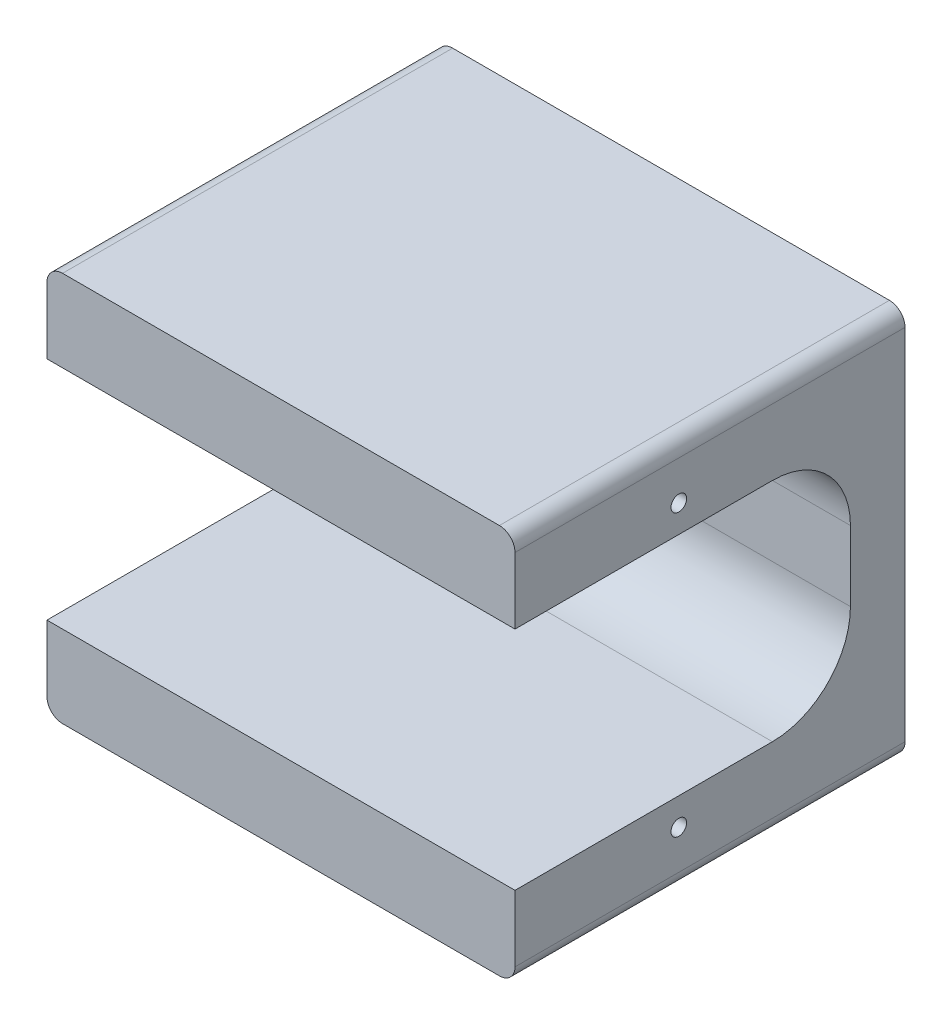
ISO-10303-21;
HEADER;
FILE_DESCRIPTION(('STEP AP214'),'2;1');
FILE_NAME('part.step','',(''),(''),'','','');
FILE_SCHEMA(('AUTOMOTIVE_DESIGN { 1 0 10303 214 1 1 1 1 }'));
ENDSEC;
DATA;
#1=APPLICATION_CONTEXT('core data for automotive mechanical design processes');
#2=APPLICATION_PROTOCOL_DEFINITION('international standard','automotive_design',2000,#1);
#3=PRODUCT_CONTEXT('',#1,'mechanical');
#4=PRODUCT('Part','Part','',(#3));
#5=PRODUCT_RELATED_PRODUCT_CATEGORY('part','',(#4));
#6=PRODUCT_DEFINITION_FORMATION('','',#4);
#7=PRODUCT_DEFINITION_CONTEXT('part definition',#1,'design');
#8=PRODUCT_DEFINITION('design','',#6,#7);
#9=PRODUCT_DEFINITION_SHAPE('','',#8);
#10=(LENGTH_UNIT() NAMED_UNIT(*) SI_UNIT(.MILLI.,.METRE.));
#11=(NAMED_UNIT(*) PLANE_ANGLE_UNIT() SI_UNIT($,.RADIAN.));
#12=(NAMED_UNIT(*) SI_UNIT($,.STERADIAN.) SOLID_ANGLE_UNIT());
#13=UNCERTAINTY_MEASURE_WITH_UNIT(LENGTH_MEASURE(1.E-05),#10,'distance_accuracy_value','');
#14=(GEOMETRIC_REPRESENTATION_CONTEXT(3) GLOBAL_UNCERTAINTY_ASSIGNED_CONTEXT((#13)) GLOBAL_UNIT_ASSIGNED_CONTEXT((#10,
#11,#12)) REPRESENTATION_CONTEXT('',''));
#15=CARTESIAN_POINT('',(0.,0.,0.));
#16=DIRECTION('',(0.,0.,1.));
#17=DIRECTION('',(1.,0.,0.));
#18=AXIS2_PLACEMENT_3D('',#15,#16,#17);
#19=CARTESIAN_POINT('',(-30.,-25.,50.));
#20=DIRECTION('',(1.,0.,0.));
#21=DIRECTION('',(0.,0.,-1.));
#22=AXIS2_PLACEMENT_3D('',#19,#20,#21);
#23=PLANE('',#22);
#24=CARTESIAN_POINT('',(-30.,-18.,29.));
#25=DIRECTION('',(1.,0.,0.));
#26=DIRECTION('',(0.,0.,-1.));
#27=AXIS2_PLACEMENT_3D('',#24,#25,#26);
#28=CIRCLE('',#27,1.);
#29=CARTESIAN_POINT('',(-30.,-18.,28.));
#30=VERTEX_POINT('',#29);
#31=EDGE_CURVE('E298',#30,#30,#28,.T.);
#32=ORIENTED_EDGE('',*,*,#31,.T.);
#33=EDGE_LOOP('',(#32));
#34=FACE_BOUND('',#33,.T.);
#35=DIRECTION('',(0.,-1.,0.));
#36=VECTOR('',#35,1.);
#37=CARTESIAN_POINT('',(-30.,-25.,0.));
#38=LINE('',#37,#36);
#39=CARTESIAN_POINT('',(-30.,23.,0.));
#40=VERTEX_POINT('',#39);
#41=CARTESIAN_POINT('',(-30.,-23.,0.));
#42=VERTEX_POINT('',#41);
#43=EDGE_CURVE('E190',#40,#42,#38,.T.);
#44=ORIENTED_EDGE('',*,*,#43,.T.);
#45=DIRECTION('',(0.,0.,-1.));
#46=VECTOR('',#45,1.);
#47=CARTESIAN_POINT('',(-30.,-23.,50.));
#48=LINE('',#47,#46);
#49=CARTESIAN_POINT('',(-30.,-23.,50.));
#50=VERTEX_POINT('',#49);
#51=EDGE_CURVE('E226',#42,#50,#48,.F.);
#52=ORIENTED_EDGE('',*,*,#51,.T.);
#53=DIRECTION('',(0.,-1.,0.));
#54=VECTOR('',#53,1.);
#55=CARTESIAN_POINT('',(-30.,-25.,50.));
#56=LINE('',#55,#54);
#57=CARTESIAN_POINT('',(-30.,-14.5,50.));
#58=VERTEX_POINT('',#57);
#59=EDGE_CURVE('E144',#58,#50,#56,.T.);
#60=ORIENTED_EDGE('',*,*,#59,.F.);
#61=DIRECTION('',(0.,0.,1.));
#62=VECTOR('',#61,1.);
#63=CARTESIAN_POINT('',(-30.,-14.5,7.00000000000001));
#64=LINE('',#63,#62);
#65=CARTESIAN_POINT('',(-30.,-14.5,17.));
#66=VERTEX_POINT('',#65);
#67=EDGE_CURVE('E154',#66,#58,#64,.T.);
#68=ORIENTED_EDGE('',*,*,#67,.F.);
#69=CARTESIAN_POINT('',(-30.,-4.5,17.));
#70=DIRECTION('',(1.,0.,0.));
#71=DIRECTION('',(0.,0.,-1.));
#72=AXIS2_PLACEMENT_3D('',#69,#70,#71);
#73=CIRCLE('',#72,10.);
#74=CARTESIAN_POINT('',(-30.,-4.5,7.00000000000001));
#75=VERTEX_POINT('',#74);
#76=EDGE_CURVE('E206',#66,#75,#73,.T.);
#77=ORIENTED_EDGE('',*,*,#76,.T.);
#78=DIRECTION('',(0.,-1.,0.));
#79=VECTOR('',#78,1.);
#80=CARTESIAN_POINT('',(-30.,-14.5,7.00000000000001));
#81=LINE('',#80,#79);
#82=CARTESIAN_POINT('',(-30.,4.5,7.00000000000001));
#83=VERTEX_POINT('',#82);
#84=EDGE_CURVE('E169',#83,#75,#81,.T.);
#85=ORIENTED_EDGE('',*,*,#84,.F.);
#86=CARTESIAN_POINT('',(-30.,4.5,17.));
#87=DIRECTION('',(1.,0.,0.));
#88=DIRECTION('',(0.,0.,-1.));
#89=AXIS2_PLACEMENT_3D('',#86,#87,#88);
#90=CIRCLE('',#89,10.);
#91=CARTESIAN_POINT('',(-30.,14.5,17.));
#92=VERTEX_POINT('',#91);
#93=EDGE_CURVE('E151',#83,#92,#90,.T.);
#94=ORIENTED_EDGE('',*,*,#93,.T.);
#95=DIRECTION('',(0.,0.,1.));
#96=VECTOR('',#95,1.);
#97=CARTESIAN_POINT('',(-30.,14.5,7.00000000000001));
#98=LINE('',#97,#96);
#99=CARTESIAN_POINT('',(-30.,14.5,50.));
#100=VERTEX_POINT('',#99);
#101=EDGE_CURVE('E147',#92,#100,#98,.T.);
#102=ORIENTED_EDGE('',*,*,#101,.T.);
#103=CARTESIAN_POINT('',(-30.,23.,50.));
#104=VERTEX_POINT('',#103);
#105=EDGE_CURVE('E133',#104,#100,#56,.T.);
#106=ORIENTED_EDGE('',*,*,#105,.F.);
#107=DIRECTION('',(0.,0.,-1.));
#108=VECTOR('',#107,1.);
#109=CARTESIAN_POINT('',(-30.,23.,50.));
#110=LINE('',#109,#108);
#111=EDGE_CURVE('E224',#104,#40,#110,.T.);
#112=ORIENTED_EDGE('',*,*,#111,.T.);
#113=EDGE_LOOP('',(#44,#52,#60,#68,#77,#85,#94,#102,#106,#112));
#114=FACE_BOUND('',#113,.T.);
#115=CARTESIAN_POINT('',(-30.,18.,29.));
#116=DIRECTION('',(1.,0.,0.));
#117=DIRECTION('',(0.,0.,1.));
#118=AXIS2_PLACEMENT_3D('',#115,#116,#117);
#119=CIRCLE('',#118,1.);
#120=CARTESIAN_POINT('',(-30.,18.,30.));
#121=VERTEX_POINT('',#120);
#122=EDGE_CURVE('E304',#121,#121,#119,.T.);
#123=ORIENTED_EDGE('',*,*,#122,.T.);
#124=EDGE_LOOP('',(#123));
#125=FACE_BOUND('',#124,.T.);
#126=ADVANCED_FACE('F33',(#34,#114,#125),#23,.F.);
#127=CARTESIAN_POINT('',(0.,0.,50.));
#128=DIRECTION('',(0.,0.,-1.));
#129=DIRECTION('',(-1.,0.,0.));
#130=AXIS2_PLACEMENT_3D('',#127,#128,#129);
#131=PLANE('',#130);
#132=ORIENTED_EDGE('',*,*,#59,.T.);
#133=CARTESIAN_POINT('',(-28.,-23.,50.));
#134=DIRECTION('',(0.,0.,-1.));
#135=DIRECTION('',(-1.,0.,0.));
#136=AXIS2_PLACEMENT_3D('',#133,#134,#135);
#137=CIRCLE('',#136,2.);
#138=CARTESIAN_POINT('',(-28.,-25.,50.));
#139=VERTEX_POINT('',#138);
#140=EDGE_CURVE('E230',#50,#139,#137,.F.);
#141=ORIENTED_EDGE('',*,*,#140,.T.);
#142=DIRECTION('',(1.,0.,0.));
#143=VECTOR('',#142,1.);
#144=CARTESIAN_POINT('',(-30.,-25.,50.));
#145=LINE('',#144,#143);
#146=CARTESIAN_POINT('',(28.,-25.,50.));
#147=VERTEX_POINT('',#146);
#148=EDGE_CURVE('E143',#139,#147,#145,.T.);
#149=ORIENTED_EDGE('',*,*,#148,.T.);
#150=CARTESIAN_POINT('',(28.,-23.,50.));
#151=DIRECTION('',(0.,0.,-1.));
#152=DIRECTION('',(-1.,0.,0.));
#153=AXIS2_PLACEMENT_3D('',#150,#151,#152);
#154=CIRCLE('',#153,2.);
#155=CARTESIAN_POINT('',(30.,-23.,50.));
#156=VERTEX_POINT('',#155);
#157=EDGE_CURVE('E228',#147,#156,#154,.F.);
#158=ORIENTED_EDGE('',*,*,#157,.T.);
#159=DIRECTION('',(0.,1.,0.));
#160=VECTOR('',#159,1.);
#161=CARTESIAN_POINT('',(30.,-25.,50.));
#162=LINE('',#161,#160);
#163=CARTESIAN_POINT('',(30.,-14.5,50.));
#164=VERTEX_POINT('',#163);
#165=EDGE_CURVE('E178',#156,#164,#162,.T.);
#166=ORIENTED_EDGE('',*,*,#165,.T.);
#167=DIRECTION('',(1.,0.,0.));
#168=VECTOR('',#167,1.);
#169=CARTESIAN_POINT('',(-30.,-14.5,50.));
#170=LINE('',#169,#168);
#171=EDGE_CURVE('E159',#58,#164,#170,.T.);
#172=ORIENTED_EDGE('',*,*,#171,.F.);
#173=EDGE_LOOP('',(#132,#141,#149,#158,#166,#172));
#174=FACE_BOUND('',#173,.T.);
#175=ADVANCED_FACE('F260',(#174),#131,.F.);
#176=CARTESIAN_POINT('',(30.,-25.,50.));
#177=DIRECTION('',(-1.,0.,0.));
#178=DIRECTION('',(0.,0.,1.));
#179=AXIS2_PLACEMENT_3D('',#176,#177,#178);
#180=PLANE('',#179);
#181=CARTESIAN_POINT('',(30.,18.,29.));
#182=DIRECTION('',(1.,0.,0.));
#183=DIRECTION('',(0.,0.,1.));
#184=AXIS2_PLACEMENT_3D('',#181,#182,#183);
#185=CIRCLE('',#184,1.);
#186=CARTESIAN_POINT('',(30.,18.,30.));
#187=VERTEX_POINT('',#186);
#188=EDGE_CURVE('E292',#187,#187,#185,.T.);
#189=ORIENTED_EDGE('',*,*,#188,.F.);
#190=EDGE_LOOP('',(#189));
#191=FACE_BOUND('',#190,.T.);
#192=CARTESIAN_POINT('',(30.,-18.,29.));
#193=DIRECTION('',(1.,0.,0.));
#194=DIRECTION('',(0.,0.,-1.));
#195=AXIS2_PLACEMENT_3D('',#192,#193,#194);
#196=CIRCLE('',#195,1.);
#197=CARTESIAN_POINT('',(30.,-18.,28.));
#198=VERTEX_POINT('',#197);
#199=EDGE_CURVE('E166',#198,#198,#196,.T.);
#200=ORIENTED_EDGE('',*,*,#199,.F.);
#201=EDGE_LOOP('',(#200));
#202=FACE_BOUND('',#201,.T.);
#203=ORIENTED_EDGE('',*,*,#165,.F.);
#204=DIRECTION('',(0.,0.,-1.));
#205=VECTOR('',#204,1.);
#206=CARTESIAN_POINT('',(30.,-23.,50.));
#207=LINE('',#206,#205);
#208=CARTESIAN_POINT('',(30.,-23.,0.));
#209=VERTEX_POINT('',#208);
#210=EDGE_CURVE('E234',#156,#209,#207,.T.);
#211=ORIENTED_EDGE('',*,*,#210,.T.);
#212=DIRECTION('',(0.,1.,0.));
#213=VECTOR('',#212,1.);
#214=CARTESIAN_POINT('',(30.,-25.,0.));
#215=LINE('',#214,#213);
#216=CARTESIAN_POINT('',(30.,23.,0.));
#217=VERTEX_POINT('',#216);
#218=EDGE_CURVE('E175',#209,#217,#215,.T.);
#219=ORIENTED_EDGE('',*,*,#218,.T.);
#220=DIRECTION('',(0.,0.,-1.));
#221=VECTOR('',#220,1.);
#222=CARTESIAN_POINT('',(30.,23.,50.));
#223=LINE('',#222,#221);
#224=CARTESIAN_POINT('',(30.,23.,50.));
#225=VERTEX_POINT('',#224);
#226=EDGE_CURVE('E232',#217,#225,#223,.F.);
#227=ORIENTED_EDGE('',*,*,#226,.T.);
#228=CARTESIAN_POINT('',(30.,14.5,50.));
#229=VERTEX_POINT('',#228);
#230=EDGE_CURVE('E181',#229,#225,#162,.T.);
#231=ORIENTED_EDGE('',*,*,#230,.F.);
#232=DIRECTION('',(0.,0.,1.));
#233=VECTOR('',#232,1.);
#234=CARTESIAN_POINT('',(30.,14.5,7.00000000000001));
#235=LINE('',#234,#233);
#236=CARTESIAN_POINT('',(30.,14.5,17.));
#237=VERTEX_POINT('',#236);
#238=EDGE_CURVE('E155',#237,#229,#235,.T.);
#239=ORIENTED_EDGE('',*,*,#238,.F.);
#240=CARTESIAN_POINT('',(30.,4.5,17.));
#241=DIRECTION('',(-1.,0.,0.));
#242=DIRECTION('',(0.,0.,1.));
#243=AXIS2_PLACEMENT_3D('',#240,#241,#242);
#244=CIRCLE('',#243,10.);
#245=CARTESIAN_POINT('',(30.,4.5,7.00000000000001));
#246=VERTEX_POINT('',#245);
#247=EDGE_CURVE('E209',#237,#246,#244,.T.);
#248=ORIENTED_EDGE('',*,*,#247,.T.);
#249=DIRECTION('',(0.,1.,0.));
#250=VECTOR('',#249,1.);
#251=CARTESIAN_POINT('',(30.,-14.5,7.00000000000001));
#252=LINE('',#251,#250);
#253=CARTESIAN_POINT('',(30.,-4.5,7.00000000000001));
#254=VERTEX_POINT('',#253);
#255=EDGE_CURVE('E163',#254,#246,#252,.T.);
#256=ORIENTED_EDGE('',*,*,#255,.F.);
#257=CARTESIAN_POINT('',(30.,-4.5,17.));
#258=DIRECTION('',(-1.,0.,0.));
#259=DIRECTION('',(0.,0.,1.));
#260=AXIS2_PLACEMENT_3D('',#257,#258,#259);
#261=CIRCLE('',#260,10.);
#262=CARTESIAN_POINT('',(30.,-14.5,17.));
#263=VERTEX_POINT('',#262);
#264=EDGE_CURVE('E204',#254,#263,#261,.T.);
#265=ORIENTED_EDGE('',*,*,#264,.T.);
#266=DIRECTION('',(0.,0.,1.));
#267=VECTOR('',#266,1.);
#268=CARTESIAN_POINT('',(30.,-14.5,7.00000000000001));
#269=LINE('',#268,#267);
#270=EDGE_CURVE('E172',#263,#164,#269,.T.);
#271=ORIENTED_EDGE('',*,*,#270,.T.);
#272=EDGE_LOOP('',(#203,#211,#219,#227,#231,#239,#248,#256,#265,#271));
#273=FACE_BOUND('',#272,.T.);
#274=ADVANCED_FACE('F271',(#191,#202,#273),#180,.F.);
#275=CARTESIAN_POINT('',(-30.,25.,50.));
#276=DIRECTION('',(0.,-1.,0.));
#277=DIRECTION('',(0.,0.,-1.));
#278=AXIS2_PLACEMENT_3D('',#275,#276,#277);
#279=PLANE('',#278);
#280=DIRECTION('',(-1.,0.,0.));
#281=VECTOR('',#280,1.);
#282=CARTESIAN_POINT('',(-30.,25.,0.));
#283=LINE('',#282,#281);
#284=CARTESIAN_POINT('',(28.,25.,0.));
#285=VERTEX_POINT('',#284);
#286=CARTESIAN_POINT('',(-28.,25.,0.));
#287=VERTEX_POINT('',#286);
#288=EDGE_CURVE('E188',#285,#287,#283,.T.);
#289=ORIENTED_EDGE('',*,*,#288,.T.);
#290=DIRECTION('',(0.,0.,-1.));
#291=VECTOR('',#290,1.);
#292=CARTESIAN_POINT('',(-28.,25.,50.));
#293=LINE('',#292,#291);
#294=CARTESIAN_POINT('',(-28.,25.,50.));
#295=VERTEX_POINT('',#294);
#296=EDGE_CURVE('E48',#287,#295,#293,.F.);
#297=ORIENTED_EDGE('',*,*,#296,.T.);
#298=DIRECTION('',(-1.,0.,0.));
#299=VECTOR('',#298,1.);
#300=CARTESIAN_POINT('',(-30.,25.,50.));
#301=LINE('',#300,#299);
#302=CARTESIAN_POINT('',(28.,25.,50.));
#303=VERTEX_POINT('',#302);
#304=EDGE_CURVE('E180',#303,#295,#301,.T.);
#305=ORIENTED_EDGE('',*,*,#304,.F.);
#306=DIRECTION('',(0.,0.,-1.));
#307=VECTOR('',#306,1.);
#308=CARTESIAN_POINT('',(28.,25.,50.));
#309=LINE('',#308,#307);
#310=EDGE_CURVE('E237',#303,#285,#309,.T.);
#311=ORIENTED_EDGE('',*,*,#310,.T.);
#312=EDGE_LOOP('',(#289,#297,#305,#311));
#313=FACE_BOUND('',#312,.T.);
#314=ADVANCED_FACE('F242',(#313),#279,.F.);
#315=CARTESIAN_POINT('',(-30.,-25.,50.));
#316=DIRECTION('',(0.,1.,0.));
#317=DIRECTION('',(0.,0.,1.));
#318=AXIS2_PLACEMENT_3D('',#315,#316,#317);
#319=PLANE('',#318);
#320=ORIENTED_EDGE('',*,*,#148,.F.);
#321=DIRECTION('',(0.,0.,-1.));
#322=VECTOR('',#321,1.);
#323=CARTESIAN_POINT('',(-28.,-25.,50.));
#324=LINE('',#323,#322);
#325=CARTESIAN_POINT('',(-28.,-25.,0.));
#326=VERTEX_POINT('',#325);
#327=EDGE_CURVE('E213',#139,#326,#324,.T.);
#328=ORIENTED_EDGE('',*,*,#327,.T.);
#329=DIRECTION('',(1.,0.,0.));
#330=VECTOR('',#329,1.);
#331=CARTESIAN_POINT('',(-30.,-25.,0.));
#332=LINE('',#331,#330);
#333=CARTESIAN_POINT('',(28.,-25.,0.));
#334=VERTEX_POINT('',#333);
#335=EDGE_CURVE('E192',#326,#334,#332,.T.);
#336=ORIENTED_EDGE('',*,*,#335,.T.);
#337=DIRECTION('',(0.,0.,-1.));
#338=VECTOR('',#337,1.);
#339=CARTESIAN_POINT('',(28.,-25.,50.));
#340=LINE('',#339,#338);
#341=EDGE_CURVE('E211',#334,#147,#340,.F.);
#342=ORIENTED_EDGE('',*,*,#341,.T.);
#343=EDGE_LOOP('',(#320,#328,#336,#342));
#344=FACE_BOUND('',#343,.T.);
#345=ADVANCED_FACE('F264',(#344),#319,.F.);
#346=ORIENTED_EDGE('',*,*,#304,.T.);
#347=CARTESIAN_POINT('',(-28.,23.,50.));
#348=DIRECTION('',(0.,0.,-1.));
#349=DIRECTION('',(-1.,0.,0.));
#350=AXIS2_PLACEMENT_3D('',#347,#348,#349);
#351=CIRCLE('',#350,2.);
#352=EDGE_CURVE('E11',#295,#104,#351,.F.);
#353=ORIENTED_EDGE('',*,*,#352,.T.);
#354=ORIENTED_EDGE('',*,*,#105,.T.);
#355=DIRECTION('',(-1.,0.,0.));
#356=VECTOR('',#355,1.);
#357=CARTESIAN_POINT('',(-30.,14.5,50.));
#358=LINE('',#357,#356);
#359=EDGE_CURVE('E137',#229,#100,#358,.T.);
#360=ORIENTED_EDGE('',*,*,#359,.F.);
#361=ORIENTED_EDGE('',*,*,#230,.T.);
#362=CARTESIAN_POINT('',(28.,23.,50.));
#363=DIRECTION('',(0.,0.,-1.));
#364=DIRECTION('',(-1.,0.,0.));
#365=AXIS2_PLACEMENT_3D('',#362,#363,#364);
#366=CIRCLE('',#365,2.);
#367=EDGE_CURVE('E41',#225,#303,#366,.F.);
#368=ORIENTED_EDGE('',*,*,#367,.T.);
#369=EDGE_LOOP('',(#346,#353,#354,#360,#361,#368));
#370=FACE_BOUND('',#369,.T.);
#371=ADVANCED_FACE('F135',(#370),#131,.F.);
#372=CARTESIAN_POINT('',(0.,0.,0.));
#373=DIRECTION('',(0.,0.,-1.));
#374=DIRECTION('',(-1.,0.,0.));
#375=AXIS2_PLACEMENT_3D('',#372,#373,#374);
#376=PLANE('',#375);
#377=ORIENTED_EDGE('',*,*,#335,.F.);
#378=CARTESIAN_POINT('',(-28.,-23.,0.));
#379=DIRECTION('',(0.,0.,-1.));
#380=DIRECTION('',(-1.,0.,0.));
#381=AXIS2_PLACEMENT_3D('',#378,#379,#380);
#382=CIRCLE('',#381,2.);
#383=EDGE_CURVE('E222',#326,#42,#382,.T.);
#384=ORIENTED_EDGE('',*,*,#383,.T.);
#385=ORIENTED_EDGE('',*,*,#43,.F.);
#386=CARTESIAN_POINT('',(-28.,23.,0.));
#387=DIRECTION('',(0.,0.,-1.));
#388=DIRECTION('',(-1.,0.,0.));
#389=AXIS2_PLACEMENT_3D('',#386,#387,#388);
#390=CIRCLE('',#389,2.);
#391=EDGE_CURVE('E218',#40,#287,#390,.T.);
#392=ORIENTED_EDGE('',*,*,#391,.T.);
#393=ORIENTED_EDGE('',*,*,#288,.F.);
#394=CARTESIAN_POINT('',(28.,23.,0.));
#395=DIRECTION('',(0.,0.,-1.));
#396=DIRECTION('',(-1.,0.,0.));
#397=AXIS2_PLACEMENT_3D('',#394,#395,#396);
#398=CIRCLE('',#397,2.);
#399=EDGE_CURVE('E216',#285,#217,#398,.T.);
#400=ORIENTED_EDGE('',*,*,#399,.T.);
#401=ORIENTED_EDGE('',*,*,#218,.F.);
#402=CARTESIAN_POINT('',(28.,-23.,0.));
#403=DIRECTION('',(0.,0.,-1.));
#404=DIRECTION('',(-1.,0.,0.));
#405=AXIS2_PLACEMENT_3D('',#402,#403,#404);
#406=CIRCLE('',#405,2.);
#407=EDGE_CURVE('E220',#209,#334,#406,.T.);
#408=ORIENTED_EDGE('',*,*,#407,.T.);
#409=EDGE_LOOP('',(#377,#384,#385,#392,#393,#400,#401,#408));
#410=FACE_BOUND('',#409,.T.);
#411=ADVANCED_FACE('F246',(#410),#376,.T.);
#412=CARTESIAN_POINT('',(-30.,-14.5,7.00000000000001));
#413=DIRECTION('',(0.,-1.,0.));
#414=DIRECTION('',(0.,0.,-1.));
#415=AXIS2_PLACEMENT_3D('',#412,#413,#414);
#416=PLANE('',#415);
#417=ORIENTED_EDGE('',*,*,#270,.F.);
#418=DIRECTION('',(1.,0.,0.));
#419=VECTOR('',#418,1.);
#420=CARTESIAN_POINT('',(-30.,-14.5,17.));
#421=LINE('',#420,#419);
#422=EDGE_CURVE('E200',#263,#66,#421,.F.);
#423=ORIENTED_EDGE('',*,*,#422,.T.);
#424=ORIENTED_EDGE('',*,*,#67,.T.);
#425=ORIENTED_EDGE('',*,*,#171,.T.);
#426=EDGE_LOOP('',(#417,#423,#424,#425));
#427=FACE_BOUND('',#426,.T.);
#428=ADVANCED_FACE('F276',(#427),#416,.F.);
#429=CARTESIAN_POINT('',(-30.,14.5,7.00000000000001));
#430=DIRECTION('',(0.,1.,0.));
#431=DIRECTION('',(0.,0.,1.));
#432=AXIS2_PLACEMENT_3D('',#429,#430,#431);
#433=PLANE('',#432);
#434=ORIENTED_EDGE('',*,*,#101,.F.);
#435=DIRECTION('',(-1.,0.,0.));
#436=VECTOR('',#435,1.);
#437=CARTESIAN_POINT('',(30.,14.5,17.));
#438=LINE('',#437,#436);
#439=EDGE_CURVE('E202',#92,#237,#438,.F.);
#440=ORIENTED_EDGE('',*,*,#439,.T.);
#441=ORIENTED_EDGE('',*,*,#238,.T.);
#442=ORIENTED_EDGE('',*,*,#359,.T.);
#443=EDGE_LOOP('',(#434,#440,#441,#442));
#444=FACE_BOUND('',#443,.T.);
#445=ADVANCED_FACE('F157',(#444),#433,.F.);
#446=CARTESIAN_POINT('',(0.,0.,7.00000000000001));
#447=DIRECTION('',(0.,0.,-1.));
#448=DIRECTION('',(-1.,0.,0.));
#449=AXIS2_PLACEMENT_3D('',#446,#447,#448);
#450=PLANE('',#449);
#451=ORIENTED_EDGE('',*,*,#84,.T.);
#452=DIRECTION('',(1.,0.,0.));
#453=VECTOR('',#452,1.);
#454=CARTESIAN_POINT('',(30.,-4.5,7.00000000000001));
#455=LINE('',#454,#453);
#456=EDGE_CURVE('E197',#75,#254,#455,.T.);
#457=ORIENTED_EDGE('',*,*,#456,.T.);
#458=ORIENTED_EDGE('',*,*,#255,.T.);
#459=DIRECTION('',(-1.,0.,0.));
#460=VECTOR('',#459,1.);
#461=CARTESIAN_POINT('',(-30.,4.5,7.00000000000001));
#462=LINE('',#461,#460);
#463=EDGE_CURVE('E185',#246,#83,#462,.T.);
#464=ORIENTED_EDGE('',*,*,#463,.T.);
#465=EDGE_LOOP('',(#451,#457,#458,#464));
#466=FACE_BOUND('',#465,.T.);
#467=ADVANCED_FACE('F285',(#466),#450,.F.);
#468=CARTESIAN_POINT('',(0.,-4.5,17.));
#469=DIRECTION('',(-1.,0.,0.));
#470=DIRECTION('',(0.,0.,1.));
#471=AXIS2_PLACEMENT_3D('',#468,#469,#470);
#472=CYLINDRICAL_SURFACE('',#471,10.);
#473=ORIENTED_EDGE('',*,*,#76,.F.);
#474=ORIENTED_EDGE('',*,*,#422,.F.);
#475=ORIENTED_EDGE('',*,*,#264,.F.);
#476=ORIENTED_EDGE('',*,*,#456,.F.);
#477=EDGE_LOOP('',(#473,#474,#475,#476));
#478=FACE_BOUND('',#477,.T.);
#479=ADVANCED_FACE('F282',(#478),#472,.F.);
#480=CARTESIAN_POINT('',(0.,4.5,17.));
#481=DIRECTION('',(1.,0.,0.));
#482=DIRECTION('',(0.,0.,-1.));
#483=AXIS2_PLACEMENT_3D('',#480,#481,#482);
#484=CYLINDRICAL_SURFACE('',#483,10.);
#485=ORIENTED_EDGE('',*,*,#247,.F.);
#486=ORIENTED_EDGE('',*,*,#439,.F.);
#487=ORIENTED_EDGE('',*,*,#93,.F.);
#488=ORIENTED_EDGE('',*,*,#463,.F.);
#489=EDGE_LOOP('',(#485,#486,#487,#488));
#490=FACE_BOUND('',#489,.T.);
#491=ADVANCED_FACE('F338',(#490),#484,.F.);
#492=CARTESIAN_POINT('',(-28.,-23.,50.));
#493=DIRECTION('',(0.,0.,-1.));
#494=DIRECTION('',(-1.,0.,0.));
#495=AXIS2_PLACEMENT_3D('',#492,#493,#494);
#496=CYLINDRICAL_SURFACE('',#495,2.);
#497=ORIENTED_EDGE('',*,*,#140,.F.);
#498=ORIENTED_EDGE('',*,*,#51,.F.);
#499=ORIENTED_EDGE('',*,*,#383,.F.);
#500=ORIENTED_EDGE('',*,*,#327,.F.);
#501=EDGE_LOOP('',(#497,#498,#499,#500));
#502=FACE_BOUND('',#501,.T.);
#503=ADVANCED_FACE('F256',(#502),#496,.T.);
#504=CARTESIAN_POINT('',(28.,-23.,50.));
#505=DIRECTION('',(0.,0.,-1.));
#506=DIRECTION('',(-1.,0.,0.));
#507=AXIS2_PLACEMENT_3D('',#504,#505,#506);
#508=CYLINDRICAL_SURFACE('',#507,2.);
#509=ORIENTED_EDGE('',*,*,#157,.F.);
#510=ORIENTED_EDGE('',*,*,#341,.F.);
#511=ORIENTED_EDGE('',*,*,#407,.F.);
#512=ORIENTED_EDGE('',*,*,#210,.F.);
#513=EDGE_LOOP('',(#509,#510,#511,#512));
#514=FACE_BOUND('',#513,.T.);
#515=ADVANCED_FACE('F267',(#514),#508,.T.);
#516=CARTESIAN_POINT('',(-28.,23.,50.));
#517=DIRECTION('',(0.,0.,-1.));
#518=DIRECTION('',(-1.,0.,0.));
#519=AXIS2_PLACEMENT_3D('',#516,#517,#518);
#520=CYLINDRICAL_SURFACE('',#519,2.);
#521=ORIENTED_EDGE('',*,*,#352,.F.);
#522=ORIENTED_EDGE('',*,*,#296,.F.);
#523=ORIENTED_EDGE('',*,*,#391,.F.);
#524=ORIENTED_EDGE('',*,*,#111,.F.);
#525=EDGE_LOOP('',(#521,#522,#523,#524));
#526=FACE_BOUND('',#525,.T.);
#527=ADVANCED_FACE('F250',(#526),#520,.T.);
#528=CARTESIAN_POINT('',(28.,23.,50.));
#529=DIRECTION('',(0.,0.,-1.));
#530=DIRECTION('',(-1.,0.,0.));
#531=AXIS2_PLACEMENT_3D('',#528,#529,#530);
#532=CYLINDRICAL_SURFACE('',#531,2.);
#533=ORIENTED_EDGE('',*,*,#367,.F.);
#534=ORIENTED_EDGE('',*,*,#226,.F.);
#535=ORIENTED_EDGE('',*,*,#399,.F.);
#536=ORIENTED_EDGE('',*,*,#310,.F.);
#537=EDGE_LOOP('',(#533,#534,#535,#536));
#538=FACE_BOUND('',#537,.T.);
#539=ADVANCED_FACE('F35',(#538),#532,.T.);
#540=CARTESIAN_POINT('',(20.,-18.,29.));
#541=DIRECTION('',(1.,0.,0.));
#542=DIRECTION('',(0.,0.,-1.));
#543=AXIS2_PLACEMENT_3D('',#540,#541,#542);
#544=CYLINDRICAL_SURFACE('',#543,1.);
#545=CARTESIAN_POINT('',(20.,-18.,29.));
#546=DIRECTION('',(1.,0.,0.));
#547=DIRECTION('',(0.,0.,-1.));
#548=AXIS2_PLACEMENT_3D('',#545,#546,#547);
#549=CIRCLE('',#548,1.);
#550=CARTESIAN_POINT('',(20.,-18.,28.));
#551=VERTEX_POINT('',#550);
#552=EDGE_CURVE('E160',#551,#551,#549,.T.);
#553=ORIENTED_EDGE('',*,*,#552,.F.);
#554=EDGE_LOOP('',(#553));
#555=FACE_BOUND('',#554,.T.);
#556=ORIENTED_EDGE('',*,*,#199,.T.);
#557=EDGE_LOOP('',(#556));
#558=FACE_BOUND('',#557,.T.);
#559=ADVANCED_FACE('F349',(#555,#558),#544,.F.);
#560=CARTESIAN_POINT('',(20.,-18.,29.));
#561=DIRECTION('',(1.,0.,0.));
#562=DIRECTION('',(0.,0.,-1.));
#563=AXIS2_PLACEMENT_3D('',#560,#561,#562);
#564=PLANE('',#563);
#565=ORIENTED_EDGE('',*,*,#552,.T.);
#566=EDGE_LOOP('',(#565));
#567=FACE_BOUND('',#566,.T.);
#568=ADVANCED_FACE('F353',(#567),#564,.T.);
#569=CARTESIAN_POINT('',(20.,18.,29.));
#570=DIRECTION('',(1.,0.,0.));
#571=DIRECTION('',(0.,0.,-1.));
#572=AXIS2_PLACEMENT_3D('',#569,#570,#571);
#573=CYLINDRICAL_SURFACE('',#572,1.);
#574=CARTESIAN_POINT('',(20.,18.,29.));
#575=DIRECTION('',(1.,0.,0.));
#576=DIRECTION('',(0.,0.,1.));
#577=AXIS2_PLACEMENT_3D('',#574,#575,#576);
#578=CIRCLE('',#577,1.);
#579=CARTESIAN_POINT('',(20.,18.,30.));
#580=VERTEX_POINT('',#579);
#581=EDGE_CURVE('E290',#580,#580,#578,.T.);
#582=ORIENTED_EDGE('',*,*,#581,.F.);
#583=EDGE_LOOP('',(#582));
#584=FACE_BOUND('',#583,.T.);
#585=ORIENTED_EDGE('',*,*,#188,.T.);
#586=EDGE_LOOP('',(#585));
#587=FACE_BOUND('',#586,.T.);
#588=ADVANCED_FACE('F360',(#584,#587),#573,.F.);
#589=CARTESIAN_POINT('',(20.,18.,29.));
#590=DIRECTION('',(-1.,0.,0.));
#591=DIRECTION('',(0.,0.,1.));
#592=AXIS2_PLACEMENT_3D('',#589,#590,#591);
#593=PLANE('',#592);
#594=ORIENTED_EDGE('',*,*,#581,.T.);
#595=EDGE_LOOP('',(#594));
#596=FACE_BOUND('',#595,.T.);
#597=ADVANCED_FACE('F442',(#596),#593,.F.);
#598=CARTESIAN_POINT('',(-20.,-18.,29.));
#599=DIRECTION('',(-1.,0.,0.));
#600=DIRECTION('',(0.,0.,1.));
#601=AXIS2_PLACEMENT_3D('',#598,#599,#600);
#602=CYLINDRICAL_SURFACE('',#601,1.);
#603=CARTESIAN_POINT('',(-20.,-18.,29.));
#604=DIRECTION('',(1.,0.,0.));
#605=DIRECTION('',(0.,0.,-1.));
#606=AXIS2_PLACEMENT_3D('',#603,#604,#605);
#607=CIRCLE('',#606,1.);
#608=CARTESIAN_POINT('',(-20.,-18.,28.));
#609=VERTEX_POINT('',#608);
#610=EDGE_CURVE('E295',#609,#609,#607,.T.);
#611=ORIENTED_EDGE('',*,*,#610,.T.);
#612=EDGE_LOOP('',(#611));
#613=FACE_BOUND('',#612,.T.);
#614=ORIENTED_EDGE('',*,*,#31,.F.);
#615=EDGE_LOOP('',(#614));
#616=FACE_BOUND('',#615,.T.);
#617=ADVANCED_FACE('F450',(#613,#616),#602,.F.);
#618=CARTESIAN_POINT('',(-20.,-18.,29.));
#619=DIRECTION('',(-1.,0.,0.));
#620=DIRECTION('',(0.,0.,-1.));
#621=AXIS2_PLACEMENT_3D('',#618,#619,#620);
#622=PLANE('',#621);
#623=ORIENTED_EDGE('',*,*,#610,.F.);
#624=EDGE_LOOP('',(#623));
#625=FACE_BOUND('',#624,.T.);
#626=ADVANCED_FACE('F319',(#625),#622,.T.);
#627=CARTESIAN_POINT('',(-20.,18.,29.));
#628=DIRECTION('',(-1.,0.,0.));
#629=DIRECTION('',(0.,0.,1.));
#630=AXIS2_PLACEMENT_3D('',#627,#628,#629);
#631=CYLINDRICAL_SURFACE('',#630,1.);
#632=CARTESIAN_POINT('',(-20.,18.,29.));
#633=DIRECTION('',(1.,0.,0.));
#634=DIRECTION('',(0.,0.,1.));
#635=AXIS2_PLACEMENT_3D('',#632,#633,#634);
#636=CIRCLE('',#635,1.);
#637=CARTESIAN_POINT('',(-20.,18.,30.));
#638=VERTEX_POINT('',#637);
#639=EDGE_CURVE('E301',#638,#638,#636,.T.);
#640=ORIENTED_EDGE('',*,*,#639,.T.);
#641=EDGE_LOOP('',(#640));
#642=FACE_BOUND('',#641,.T.);
#643=ORIENTED_EDGE('',*,*,#122,.F.);
#644=EDGE_LOOP('',(#643));
#645=FACE_BOUND('',#644,.T.);
#646=ADVANCED_FACE('F310',(#642,#645),#631,.F.);
#647=CARTESIAN_POINT('',(-20.,18.,29.));
#648=DIRECTION('',(1.,0.,0.));
#649=DIRECTION('',(0.,0.,1.));
#650=AXIS2_PLACEMENT_3D('',#647,#648,#649);
#651=PLANE('',#650);
#652=ORIENTED_EDGE('',*,*,#639,.F.);
#653=EDGE_LOOP('',(#652));
#654=FACE_BOUND('',#653,.T.);
#655=ADVANCED_FACE('F313',(#654),#651,.F.);
#656=CLOSED_SHELL('',(#126,#175,#274,#314,#345,#371,#411,#428,#445,#467,#479,#491,#503,#515,
#527,#539,#559,#568,#588,#597,#617,#626,#646,#655));
#657=MANIFOLD_SOLID_BREP('B2',#656);
#658=ADVANCED_BREP_SHAPE_REPRESENTATION('',(#18,#657),#14);
#659=SHAPE_DEFINITION_REPRESENTATION(#9,#658);
ENDSEC;
END-ISO-10303-21;
